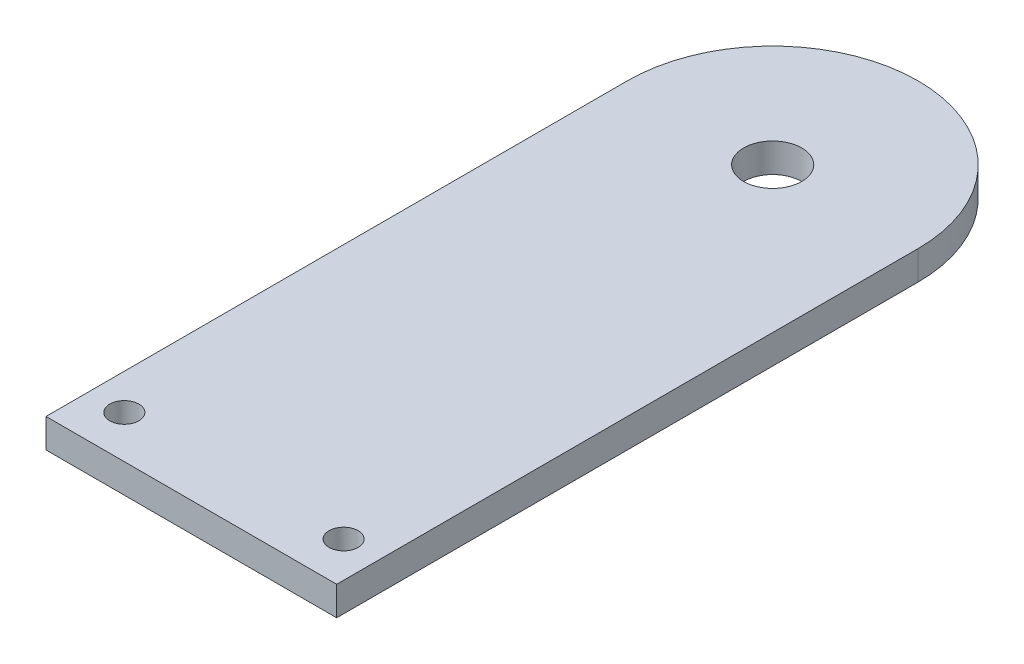
ISO-10303-21;
HEADER;
FILE_DESCRIPTION(('STEP AP214'),'2;1');
FILE_NAME('part.step','',(''),(''),'','','');
FILE_SCHEMA(('AUTOMOTIVE_DESIGN { 1 0 10303 214 1 1 1 1 }'));
ENDSEC;
DATA;
#1=APPLICATION_CONTEXT('core data for automotive mechanical design processes');
#2=APPLICATION_PROTOCOL_DEFINITION('international standard','automotive_design',2000,#1);
#3=PRODUCT_CONTEXT('',#1,'mechanical');
#4=PRODUCT('Part','Part','',(#3));
#5=PRODUCT_RELATED_PRODUCT_CATEGORY('part','',(#4));
#6=PRODUCT_DEFINITION_FORMATION('','',#4);
#7=PRODUCT_DEFINITION_CONTEXT('part definition',#1,'design');
#8=PRODUCT_DEFINITION('design','',#6,#7);
#9=PRODUCT_DEFINITION_SHAPE('','',#8);
#10=(LENGTH_UNIT() NAMED_UNIT(*) SI_UNIT(.MILLI.,.METRE.));
#11=(NAMED_UNIT(*) PLANE_ANGLE_UNIT() SI_UNIT($,.RADIAN.));
#12=(NAMED_UNIT(*) SI_UNIT($,.STERADIAN.) SOLID_ANGLE_UNIT());
#13=UNCERTAINTY_MEASURE_WITH_UNIT(LENGTH_MEASURE(1.E-05),#10,'distance_accuracy_value','');
#14=(GEOMETRIC_REPRESENTATION_CONTEXT(3) GLOBAL_UNCERTAINTY_ASSIGNED_CONTEXT((#13)) GLOBAL_UNIT_ASSIGNED_CONTEXT((#10,
#11,#12)) REPRESENTATION_CONTEXT('',''));
#15=CARTESIAN_POINT('',(0.,0.,0.));
#16=DIRECTION('',(0.,0.,1.));
#17=DIRECTION('',(1.,0.,0.));
#18=AXIS2_PLACEMENT_3D('',#15,#16,#17);
#19=CARTESIAN_POINT('',(25.,5.,-100.));
#20=DIRECTION('',(0.,1.,0.));
#21=DIRECTION('',(0.,0.,1.));
#22=AXIS2_PLACEMENT_3D('',#19,#20,#21);
#23=PLANE('',#22);
#24=CARTESIAN_POINT('',(6.1400640668012,5.,-7.33106128834252));
#25=DIRECTION('',(0.,1.,0.));
#26=DIRECTION('',(0.,0.,1.));
#27=AXIS2_PLACEMENT_3D('',#24,#25,#26);
#28=CIRCLE('',#27,2.5);
#29=CARTESIAN_POINT('',(6.1400640668012,5.,-4.83106128834252));
#30=VERTEX_POINT('',#29);
#31=EDGE_CURVE('E134',#30,#30,#28,.T.);
#32=ORIENTED_EDGE('',*,*,#31,.F.);
#33=EDGE_LOOP('',(#32));
#34=FACE_BOUND('',#33,.T.);
#35=DIRECTION('',(0.,0.,1.));
#36=VECTOR('',#35,1.);
#37=CARTESIAN_POINT('',(0.,5.,-100.));
#38=LINE('',#37,#36);
#39=CARTESIAN_POINT('',(0.,5.,-100.));
#40=VERTEX_POINT('',#39);
#41=CARTESIAN_POINT('',(0.,5.,0.));
#42=VERTEX_POINT('',#41);
#43=EDGE_CURVE('E92',#40,#42,#38,.T.);
#44=ORIENTED_EDGE('',*,*,#43,.T.);
#45=DIRECTION('',(1.,0.,0.));
#46=VECTOR('',#45,1.);
#47=CARTESIAN_POINT('',(0.,5.,0.));
#48=LINE('',#47,#46);
#49=CARTESIAN_POINT('',(50.,5.,0.));
#50=VERTEX_POINT('',#49);
#51=EDGE_CURVE('E87',#42,#50,#48,.T.);
#52=ORIENTED_EDGE('',*,*,#51,.T.);
#53=DIRECTION('',(0.,0.,-1.));
#54=VECTOR('',#53,1.);
#55=CARTESIAN_POINT('',(50.,5.,0.));
#56=LINE('',#55,#54);
#57=CARTESIAN_POINT('',(50.,5.,-100.));
#58=VERTEX_POINT('',#57);
#59=EDGE_CURVE('E90',#50,#58,#56,.T.);
#60=ORIENTED_EDGE('',*,*,#59,.T.);
#61=CARTESIAN_POINT('',(25.,5.,-100.));
#62=DIRECTION('',(0.,1.,0.));
#63=DIRECTION('',(0.,0.,1.));
#64=AXIS2_PLACEMENT_3D('',#61,#62,#63);
#65=CIRCLE('',#64,25.);
#66=EDGE_CURVE('E57',#58,#40,#65,.T.);
#67=ORIENTED_EDGE('',*,*,#66,.T.);
#68=EDGE_LOOP('',(#44,#52,#60,#67));
#69=FACE_BOUND('',#68,.T.);
#70=CARTESIAN_POINT('',(25.,5.,-100.));
#71=DIRECTION('',(0.,1.,0.));
#72=DIRECTION('',(0.,0.,1.));
#73=AXIS2_PLACEMENT_3D('',#70,#71,#72);
#74=CIRCLE('',#73,5.);
#75=CARTESIAN_POINT('',(25.,5.,-95.));
#76=VERTEX_POINT('',#75);
#77=EDGE_CURVE('E112',#76,#76,#74,.T.);
#78=ORIENTED_EDGE('',*,*,#77,.F.);
#79=EDGE_LOOP('',(#78));
#80=FACE_BOUND('',#79,.T.);
#81=CARTESIAN_POINT('',(43.8599359331988,5.,-7.33106128834252));
#82=DIRECTION('',(0.,1.,0.));
#83=DIRECTION('',(0.,0.,-1.));
#84=AXIS2_PLACEMENT_3D('',#81,#82,#83);
#85=CIRCLE('',#84,2.5);
#86=CARTESIAN_POINT('',(43.8599359331988,5.,-9.83106128834252));
#87=VERTEX_POINT('',#86);
#88=EDGE_CURVE('E142',#87,#87,#85,.T.);
#89=ORIENTED_EDGE('',*,*,#88,.F.);
#90=EDGE_LOOP('',(#89));
#91=FACE_BOUND('',#90,.T.);
#92=ADVANCED_FACE('F39',(#34,#69,#80,#91),#23,.T.);
#93=CARTESIAN_POINT('',(25.,0.,-100.));
#94=DIRECTION('',(0.,1.,0.));
#95=DIRECTION('',(0.,0.,1.));
#96=AXIS2_PLACEMENT_3D('',#93,#94,#95);
#97=PLANE('',#96);
#98=DIRECTION('',(0.,0.,1.));
#99=VECTOR('',#98,1.);
#100=CARTESIAN_POINT('',(0.,0.,-100.));
#101=LINE('',#100,#99);
#102=CARTESIAN_POINT('',(0.,0.,-100.));
#103=VERTEX_POINT('',#102);
#104=CARTESIAN_POINT('',(0.,0.,0.));
#105=VERTEX_POINT('',#104);
#106=EDGE_CURVE('E108',#103,#105,#101,.T.);
#107=ORIENTED_EDGE('',*,*,#106,.F.);
#108=CARTESIAN_POINT('',(25.,0.,-100.));
#109=DIRECTION('',(0.,1.,0.));
#110=DIRECTION('',(0.,0.,1.));
#111=AXIS2_PLACEMENT_3D('',#108,#109,#110);
#112=CIRCLE('',#111,25.);
#113=CARTESIAN_POINT('',(50.,0.,-100.));
#114=VERTEX_POINT('',#113);
#115=EDGE_CURVE('E80',#114,#103,#112,.T.);
#116=ORIENTED_EDGE('',*,*,#115,.F.);
#117=DIRECTION('',(0.,0.,-1.));
#118=VECTOR('',#117,1.);
#119=CARTESIAN_POINT('',(50.,0.,0.));
#120=LINE('',#119,#118);
#121=CARTESIAN_POINT('',(50.,0.,0.));
#122=VERTEX_POINT('',#121);
#123=EDGE_CURVE('E74',#122,#114,#120,.T.);
#124=ORIENTED_EDGE('',*,*,#123,.F.);
#125=DIRECTION('',(1.,0.,0.));
#126=VECTOR('',#125,1.);
#127=CARTESIAN_POINT('',(0.,0.,0.));
#128=LINE('',#127,#126);
#129=EDGE_CURVE('E97',#105,#122,#128,.T.);
#130=ORIENTED_EDGE('',*,*,#129,.F.);
#131=EDGE_LOOP('',(#107,#116,#124,#130));
#132=FACE_BOUND('',#131,.T.);
#133=CARTESIAN_POINT('',(25.,0.,-100.));
#134=DIRECTION('',(0.,1.,0.));
#135=DIRECTION('',(0.,0.,1.));
#136=AXIS2_PLACEMENT_3D('',#133,#134,#135);
#137=CIRCLE('',#136,5.);
#138=CARTESIAN_POINT('',(25.,0.,-95.));
#139=VERTEX_POINT('',#138);
#140=EDGE_CURVE('E130',#139,#139,#137,.T.);
#141=ORIENTED_EDGE('',*,*,#140,.T.);
#142=EDGE_LOOP('',(#141));
#143=FACE_BOUND('',#142,.T.);
#144=CARTESIAN_POINT('',(6.1400640668012,0.,-7.33106128834252));
#145=DIRECTION('',(0.,1.,0.));
#146=DIRECTION('',(0.,0.,1.));
#147=AXIS2_PLACEMENT_3D('',#144,#145,#146);
#148=CIRCLE('',#147,2.5);
#149=CARTESIAN_POINT('',(6.1400640668012,0.,-4.83106128834252));
#150=VERTEX_POINT('',#149);
#151=EDGE_CURVE('E138',#150,#150,#148,.T.);
#152=ORIENTED_EDGE('',*,*,#151,.T.);
#153=EDGE_LOOP('',(#152));
#154=FACE_BOUND('',#153,.T.);
#155=CARTESIAN_POINT('',(43.8599359331988,0.,-7.33106128834252));
#156=DIRECTION('',(0.,1.,0.));
#157=DIRECTION('',(0.,0.,-1.));
#158=AXIS2_PLACEMENT_3D('',#155,#156,#157);
#159=CIRCLE('',#158,2.5);
#160=CARTESIAN_POINT('',(43.8599359331988,0.,-9.83106128834252));
#161=VERTEX_POINT('',#160);
#162=EDGE_CURVE('E146',#161,#161,#159,.T.);
#163=ORIENTED_EDGE('',*,*,#162,.T.);
#164=EDGE_LOOP('',(#163));
#165=FACE_BOUND('',#164,.T.);
#166=ADVANCED_FACE('F125',(#132,#143,#154,#165),#97,.F.);
#167=CARTESIAN_POINT('',(0.,5.,-100.));
#168=DIRECTION('',(1.,0.,0.));
#169=DIRECTION('',(0.,0.,-1.));
#170=AXIS2_PLACEMENT_3D('',#167,#168,#169);
#171=PLANE('',#170);
#172=ORIENTED_EDGE('',*,*,#106,.T.);
#173=DIRECTION('',(0.,-1.,0.));
#174=VECTOR('',#173,1.);
#175=CARTESIAN_POINT('',(0.,5.,0.));
#176=LINE('',#175,#174);
#177=EDGE_CURVE('E11',#42,#105,#176,.T.);
#178=ORIENTED_EDGE('',*,*,#177,.F.);
#179=ORIENTED_EDGE('',*,*,#43,.F.);
#180=DIRECTION('',(0.,-1.,0.));
#181=VECTOR('',#180,1.);
#182=CARTESIAN_POINT('',(0.,5.,-100.));
#183=LINE('',#182,#181);
#184=EDGE_CURVE('E104',#40,#103,#183,.T.);
#185=ORIENTED_EDGE('',*,*,#184,.T.);
#186=EDGE_LOOP('',(#172,#178,#179,#185));
#187=FACE_BOUND('',#186,.T.);
#188=ADVANCED_FACE('F41',(#187),#171,.F.);
#189=CARTESIAN_POINT('',(0.,5.,0.));
#190=DIRECTION('',(0.,0.,-1.));
#191=DIRECTION('',(-1.,0.,0.));
#192=AXIS2_PLACEMENT_3D('',#189,#190,#191);
#193=PLANE('',#192);
#194=ORIENTED_EDGE('',*,*,#129,.T.);
#195=DIRECTION('',(0.,-1.,0.));
#196=VECTOR('',#195,1.);
#197=CARTESIAN_POINT('',(50.,5.,0.));
#198=LINE('',#197,#196);
#199=EDGE_CURVE('E49',#50,#122,#198,.T.);
#200=ORIENTED_EDGE('',*,*,#199,.F.);
#201=ORIENTED_EDGE('',*,*,#51,.F.);
#202=ORIENTED_EDGE('',*,*,#177,.T.);
#203=EDGE_LOOP('',(#194,#200,#201,#202));
#204=FACE_BOUND('',#203,.T.);
#205=ADVANCED_FACE('F96',(#204),#193,.F.);
#206=CARTESIAN_POINT('',(50.,5.,0.));
#207=DIRECTION('',(-1.,0.,0.));
#208=DIRECTION('',(0.,0.,1.));
#209=AXIS2_PLACEMENT_3D('',#206,#207,#208);
#210=PLANE('',#209);
#211=ORIENTED_EDGE('',*,*,#123,.T.);
#212=DIRECTION('',(0.,-1.,0.));
#213=VECTOR('',#212,1.);
#214=CARTESIAN_POINT('',(50.,5.,-100.));
#215=LINE('',#214,#213);
#216=EDGE_CURVE('E99',#58,#114,#215,.T.);
#217=ORIENTED_EDGE('',*,*,#216,.F.);
#218=ORIENTED_EDGE('',*,*,#59,.F.);
#219=ORIENTED_EDGE('',*,*,#199,.T.);
#220=EDGE_LOOP('',(#211,#217,#218,#219));
#221=FACE_BOUND('',#220,.T.);
#222=ADVANCED_FACE('F100',(#221),#210,.F.);
#223=CARTESIAN_POINT('',(25.,5.,-100.));
#224=DIRECTION('',(0.,-1.,0.));
#225=DIRECTION('',(0.,0.,-1.));
#226=AXIS2_PLACEMENT_3D('',#223,#224,#225);
#227=CYLINDRICAL_SURFACE('',#226,25.);
#228=ORIENTED_EDGE('',*,*,#115,.T.);
#229=ORIENTED_EDGE('',*,*,#184,.F.);
#230=ORIENTED_EDGE('',*,*,#66,.F.);
#231=ORIENTED_EDGE('',*,*,#216,.T.);
#232=EDGE_LOOP('',(#228,#229,#230,#231));
#233=FACE_BOUND('',#232,.T.);
#234=ADVANCED_FACE('F122',(#233),#227,.T.);
#235=CARTESIAN_POINT('',(25.,5.,-100.));
#236=DIRECTION('',(0.,-1.,0.));
#237=DIRECTION('',(0.,0.,-1.));
#238=AXIS2_PLACEMENT_3D('',#235,#236,#237);
#239=CYLINDRICAL_SURFACE('',#238,5.);
#240=ORIENTED_EDGE('',*,*,#77,.T.);
#241=EDGE_LOOP('',(#240));
#242=FACE_BOUND('',#241,.T.);
#243=ORIENTED_EDGE('',*,*,#140,.F.);
#244=EDGE_LOOP('',(#243));
#245=FACE_BOUND('',#244,.T.);
#246=ADVANCED_FACE('F166',(#242,#245),#239,.F.);
#247=CARTESIAN_POINT('',(6.1400640668012,5.,-7.33106128834252));
#248=DIRECTION('',(0.,-1.,0.));
#249=DIRECTION('',(0.,0.,-1.));
#250=AXIS2_PLACEMENT_3D('',#247,#248,#249);
#251=CYLINDRICAL_SURFACE('',#250,2.5);
#252=ORIENTED_EDGE('',*,*,#31,.T.);
#253=EDGE_LOOP('',(#252));
#254=FACE_BOUND('',#253,.T.);
#255=ORIENTED_EDGE('',*,*,#151,.F.);
#256=EDGE_LOOP('',(#255));
#257=FACE_BOUND('',#256,.T.);
#258=ADVANCED_FACE('F212',(#254,#257),#251,.F.);
#259=CARTESIAN_POINT('',(43.8599359331988,5.,-7.33106128834252));
#260=DIRECTION('',(0.,-1.,0.));
#261=DIRECTION('',(0.,0.,-1.));
#262=AXIS2_PLACEMENT_3D('',#259,#260,#261);
#263=CYLINDRICAL_SURFACE('',#262,2.5);
#264=ORIENTED_EDGE('',*,*,#88,.T.);
#265=EDGE_LOOP('',(#264));
#266=FACE_BOUND('',#265,.T.);
#267=ORIENTED_EDGE('',*,*,#162,.F.);
#268=EDGE_LOOP('',(#267));
#269=FACE_BOUND('',#268,.T.);
#270=ADVANCED_FACE('F154',(#266,#269),#263,.F.);
#271=CLOSED_SHELL('',(#92,#166,#188,#205,#222,#234,#246,#258,#270));
#272=MANIFOLD_SOLID_BREP('B2',#271);
#273=ADVANCED_BREP_SHAPE_REPRESENTATION('',(#18,#272),#14);
#274=SHAPE_DEFINITION_REPRESENTATION(#9,#273);
ENDSEC;
END-ISO-10303-21;
